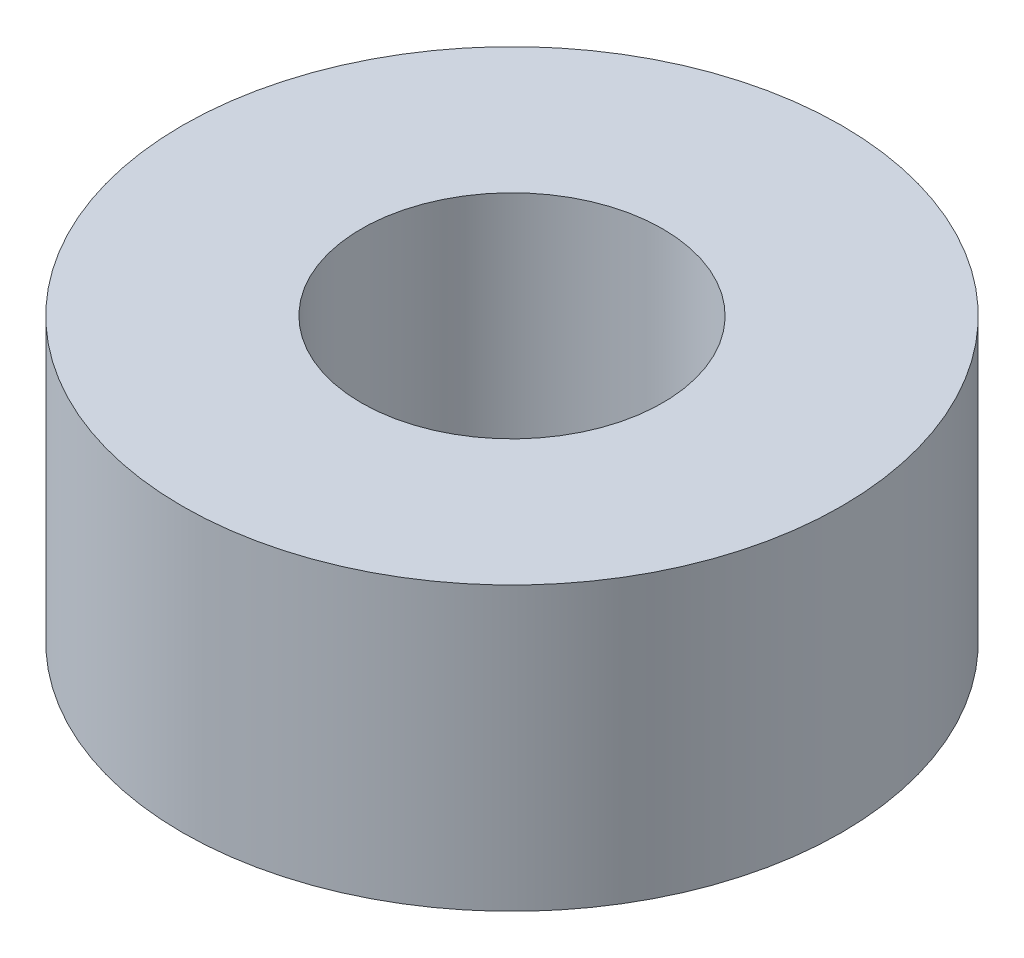
ISO-10303-21;
HEADER;
FILE_DESCRIPTION(('STEP AP214'),'2;1');
FILE_NAME('part.step','',(''),(''),'','','');
FILE_SCHEMA(('AUTOMOTIVE_DESIGN { 1 0 10303 214 1 1 1 1 }'));
ENDSEC;
DATA;
#1=APPLICATION_CONTEXT('core data for automotive mechanical design processes');
#2=APPLICATION_PROTOCOL_DEFINITION('international standard','automotive_design',2000,#1);
#3=PRODUCT_CONTEXT('',#1,'mechanical');
#4=PRODUCT('Part','Part','',(#3));
#5=PRODUCT_RELATED_PRODUCT_CATEGORY('part','',(#4));
#6=PRODUCT_DEFINITION_FORMATION('','',#4);
#7=PRODUCT_DEFINITION_CONTEXT('part definition',#1,'design');
#8=PRODUCT_DEFINITION('design','',#6,#7);
#9=PRODUCT_DEFINITION_SHAPE('','',#8);
#10=(LENGTH_UNIT() NAMED_UNIT(*) SI_UNIT(.MILLI.,.METRE.));
#11=(NAMED_UNIT(*) PLANE_ANGLE_UNIT() SI_UNIT($,.RADIAN.));
#12=(NAMED_UNIT(*) SI_UNIT($,.STERADIAN.) SOLID_ANGLE_UNIT());
#13=UNCERTAINTY_MEASURE_WITH_UNIT(LENGTH_MEASURE(1.E-05),#10,'distance_accuracy_value','');
#14=(GEOMETRIC_REPRESENTATION_CONTEXT(3) GLOBAL_UNCERTAINTY_ASSIGNED_CONTEXT((#13)) GLOBAL_UNIT_ASSIGNED_CONTEXT((#10,
#11,#12)) REPRESENTATION_CONTEXT('',''));
#15=CARTESIAN_POINT('',(0.,0.,0.));
#16=DIRECTION('',(0.,0.,1.));
#17=DIRECTION('',(1.,0.,0.));
#18=AXIS2_PLACEMENT_3D('',#15,#16,#17);
#19=CARTESIAN_POINT('',(0.,3.,0.));
#20=DIRECTION('',(0.,1.,0.));
#21=DIRECTION('',(0.,0.,1.));
#22=AXIS2_PLACEMENT_3D('',#19,#20,#21);
#23=PLANE('',#22);
#24=CARTESIAN_POINT('',(0.,3.,0.));
#25=DIRECTION('',(0.,1.,0.));
#26=DIRECTION('',(0.,0.,1.));
#27=AXIS2_PLACEMENT_3D('',#24,#25,#26);
#28=CIRCLE('',#27,3.5);
#29=CARTESIAN_POINT('',(0.,3.,3.5));
#30=VERTEX_POINT('',#29);
#31=EDGE_CURVE('E10',#30,#30,#28,.T.);
#32=ORIENTED_EDGE('',*,*,#31,.T.);
#33=EDGE_LOOP('',(#32));
#34=FACE_BOUND('',#33,.T.);
#35=CARTESIAN_POINT('',(0.,3.,0.));
#36=DIRECTION('',(0.,1.,0.));
#37=DIRECTION('',(0.,0.,1.));
#38=AXIS2_PLACEMENT_3D('',#35,#36,#37);
#39=CIRCLE('',#38,1.6);
#40=CARTESIAN_POINT('',(0.,3.,1.6));
#41=VERTEX_POINT('',#40);
#42=EDGE_CURVE('E42',#41,#41,#39,.T.);
#43=ORIENTED_EDGE('',*,*,#42,.F.);
#44=EDGE_LOOP('',(#43));
#45=FACE_BOUND('',#44,.T.);
#46=ADVANCED_FACE('F31',(#34,#45),#23,.T.);
#47=CARTESIAN_POINT('',(0.,0.,0.));
#48=DIRECTION('',(0.,1.,0.));
#49=DIRECTION('',(0.,0.,1.));
#50=AXIS2_PLACEMENT_3D('',#47,#48,#49);
#51=PLANE('',#50);
#52=CARTESIAN_POINT('',(0.,0.,0.));
#53=DIRECTION('',(0.,1.,0.));
#54=DIRECTION('',(0.,0.,1.));
#55=AXIS2_PLACEMENT_3D('',#52,#53,#54);
#56=CIRCLE('',#55,3.5);
#57=CARTESIAN_POINT('',(0.,0.,3.5));
#58=VERTEX_POINT('',#57);
#59=EDGE_CURVE('E35',#58,#58,#56,.T.);
#60=ORIENTED_EDGE('',*,*,#59,.F.);
#61=EDGE_LOOP('',(#60));
#62=FACE_BOUND('',#61,.T.);
#63=CARTESIAN_POINT('',(0.,0.,0.));
#64=DIRECTION('',(0.,1.,0.));
#65=DIRECTION('',(0.,0.,1.));
#66=AXIS2_PLACEMENT_3D('',#63,#64,#65);
#67=CIRCLE('',#66,1.6);
#68=CARTESIAN_POINT('',(0.,0.,1.6));
#69=VERTEX_POINT('',#68);
#70=EDGE_CURVE('E44',#69,#69,#67,.T.);
#71=ORIENTED_EDGE('',*,*,#70,.T.);
#72=EDGE_LOOP('',(#71));
#73=FACE_BOUND('',#72,.T.);
#74=ADVANCED_FACE('F54',(#62,#73),#51,.F.);
#75=CARTESIAN_POINT('',(0.,3.,0.));
#76=DIRECTION('',(0.,-1.,0.));
#77=DIRECTION('',(0.,0.,-1.));
#78=AXIS2_PLACEMENT_3D('',#75,#76,#77);
#79=CYLINDRICAL_SURFACE('',#78,3.5);
#80=ORIENTED_EDGE('',*,*,#31,.F.);
#81=EDGE_LOOP('',(#80));
#82=FACE_BOUND('',#81,.T.);
#83=ORIENTED_EDGE('',*,*,#59,.T.);
#84=EDGE_LOOP('',(#83));
#85=FACE_BOUND('',#84,.T.);
#86=ADVANCED_FACE('F33',(#82,#85),#79,.T.);
#87=CARTESIAN_POINT('',(0.,3.,0.));
#88=DIRECTION('',(0.,-1.,0.));
#89=DIRECTION('',(0.,0.,-1.));
#90=AXIS2_PLACEMENT_3D('',#87,#88,#89);
#91=CYLINDRICAL_SURFACE('',#90,1.6);
#92=ORIENTED_EDGE('',*,*,#42,.T.);
#93=EDGE_LOOP('',(#92));
#94=FACE_BOUND('',#93,.T.);
#95=ORIENTED_EDGE('',*,*,#70,.F.);
#96=EDGE_LOOP('',(#95));
#97=FACE_BOUND('',#96,.T.);
#98=ADVANCED_FACE('F50',(#94,#97),#91,.F.);
#99=CLOSED_SHELL('',(#46,#74,#86,#98));
#100=MANIFOLD_SOLID_BREP('B2',#99);
#101=ADVANCED_BREP_SHAPE_REPRESENTATION('',(#18,#100),#14);
#102=SHAPE_DEFINITION_REPRESENTATION(#9,#101);
ENDSEC;
END-ISO-10303-21;
